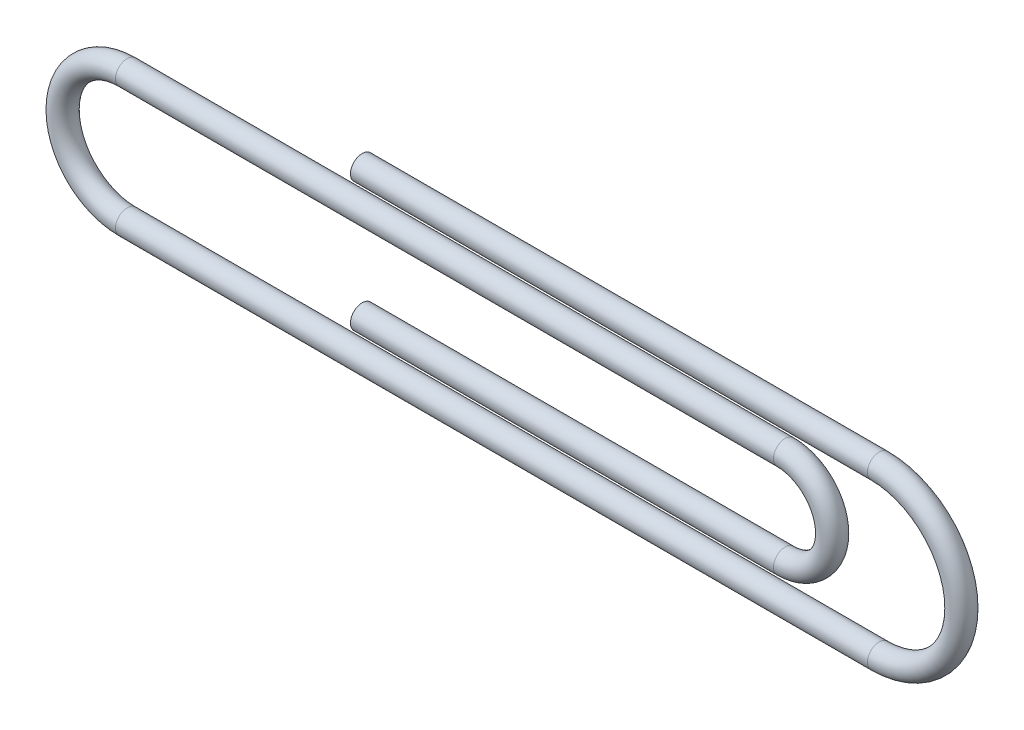
ISO-10303-21;
HEADER;
FILE_DESCRIPTION(('STEP AP214'),'2;1');
FILE_NAME('part.step','',(''),(''),'','','');
FILE_SCHEMA(('AUTOMOTIVE_DESIGN { 1 0 10303 214 1 1 1 1 }'));
ENDSEC;
DATA;
#1=APPLICATION_CONTEXT('core data for automotive mechanical design processes');
#2=APPLICATION_PROTOCOL_DEFINITION('international standard','automotive_design',2000,#1);
#3=PRODUCT_CONTEXT('',#1,'mechanical');
#4=PRODUCT('Part','Part','',(#3));
#5=PRODUCT_RELATED_PRODUCT_CATEGORY('part','',(#4));
#6=PRODUCT_DEFINITION_FORMATION('','',#4);
#7=PRODUCT_DEFINITION_CONTEXT('part definition',#1,'design');
#8=PRODUCT_DEFINITION('design','',#6,#7);
#9=PRODUCT_DEFINITION_SHAPE('','',#8);
#10=(LENGTH_UNIT() NAMED_UNIT(*) SI_UNIT(.MILLI.,.METRE.));
#11=(NAMED_UNIT(*) PLANE_ANGLE_UNIT() SI_UNIT($,.RADIAN.));
#12=(NAMED_UNIT(*) SI_UNIT($,.STERADIAN.) SOLID_ANGLE_UNIT());
#13=UNCERTAINTY_MEASURE_WITH_UNIT(LENGTH_MEASURE(1.E-05),#10,'distance_accuracy_value','');
#14=(GEOMETRIC_REPRESENTATION_CONTEXT(3) GLOBAL_UNCERTAINTY_ASSIGNED_CONTEXT((#13)) GLOBAL_UNIT_ASSIGNED_CONTEXT((#10,
#11,#12)) REPRESENTATION_CONTEXT('',''));
#15=CARTESIAN_POINT('',(0.,0.,0.));
#16=DIRECTION('',(0.,0.,1.));
#17=DIRECTION('',(1.,0.,0.));
#18=AXIS2_PLACEMENT_3D('',#15,#16,#17);
#19=CARTESIAN_POINT('',(-7.02459016393443,0.,0.));
#20=DIRECTION('',(-1.,0.,0.));
#21=DIRECTION('',(0.,-1.,0.));
#22=AXIS2_PLACEMENT_3D('',#19,#20,#21);
#23=PLANE('',#22);
#24=CARTESIAN_POINT('',(-7.02459016393443,0.,0.));
#25=DIRECTION('',(-1.,0.,0.));
#26=DIRECTION('',(0.,-1.,0.));
#27=AXIS2_PLACEMENT_3D('',#24,#25,#26);
#28=CIRCLE('',#27,0.5);
#29=CARTESIAN_POINT('',(-7.02459016393443,-0.5,0.));
#30=VERTEX_POINT('',#29);
#31=EDGE_CURVE('E88',#30,#30,#28,.T.);
#32=ORIENTED_EDGE('',*,*,#31,.T.);
#33=EDGE_LOOP('',(#32));
#34=FACE_BOUND('',#33,.T.);
#35=ADVANCED_FACE('F53',(#34),#23,.T.);
#36=CARTESIAN_POINT('',(-7.02459016393443,-5.5,0.));
#37=DIRECTION('',(1.,0.,0.));
#38=DIRECTION('',(0.,1.,0.));
#39=AXIS2_PLACEMENT_3D('',#36,#37,#38);
#40=PLANE('',#39);
#41=CARTESIAN_POINT('',(-7.02459016393443,-5.5,0.));
#42=DIRECTION('',(1.,0.,0.));
#43=DIRECTION('',(0.,1.,0.));
#44=AXIS2_PLACEMENT_3D('',#41,#42,#43);
#45=CIRCLE('',#44,0.5);
#46=CARTESIAN_POINT('',(-7.02459016393443,-5.,0.));
#47=VERTEX_POINT('',#46);
#48=EDGE_CURVE('E11',#47,#47,#45,.T.);
#49=ORIENTED_EDGE('',*,*,#48,.F.);
#50=EDGE_LOOP('',(#49));
#51=FACE_BOUND('',#50,.T.);
#52=ADVANCED_FACE('F97',(#51),#40,.F.);
#53=CARTESIAN_POINT('',(-7.02459016393443,0.,0.));
#54=DIRECTION('',(1.,0.,0.));
#55=DIRECTION('',(0.,1.,0.));
#56=AXIS2_PLACEMENT_3D('',#53,#54,#55);
#57=CYLINDRICAL_SURFACE('',#56,0.5);
#58=CARTESIAN_POINT('',(14.9754098360656,0.,0.));
#59=DIRECTION('',(-1.,0.,0.));
#60=DIRECTION('',(0.,-1.,0.));
#61=AXIS2_PLACEMENT_3D('',#58,#59,#60);
#62=CIRCLE('',#61,0.5);
#63=CARTESIAN_POINT('',(14.9754098360656,0.5,0.));
#64=VERTEX_POINT('',#63);
#65=EDGE_CURVE('E84',#64,#64,#62,.T.);
#66=ORIENTED_EDGE('',*,*,#65,.T.);
#67=EDGE_LOOP('',(#66));
#68=FACE_BOUND('',#67,.T.);
#69=ORIENTED_EDGE('',*,*,#31,.F.);
#70=EDGE_LOOP('',(#69));
#71=FACE_BOUND('',#70,.T.);
#72=ADVANCED_FACE('F94',(#68,#71),#57,.T.);
#73=CARTESIAN_POINT('',(14.9754098360656,-3.5,0.));
#74=DIRECTION('',(0.,0.,-1.));
#75=DIRECTION('',(-1.,0.,0.));
#76=AXIS2_PLACEMENT_3D('',#73,#74,#75);
#77=TOROIDAL_SURFACE('',#76,3.5,0.5);
#78=CARTESIAN_POINT('',(14.9754098360656,-7.,0.));
#79=DIRECTION('',(1.,0.,0.));
#80=DIRECTION('',(0.,1.,0.));
#81=AXIS2_PLACEMENT_3D('',#78,#79,#80);
#82=CIRCLE('',#81,0.5);
#83=CARTESIAN_POINT('',(14.9754098360656,-7.5,0.));
#84=VERTEX_POINT('',#83);
#85=EDGE_CURVE('E80',#84,#84,#82,.T.);
#86=CARTESIAN_POINT('',(14.9754098360656,-3.5,0.));
#87=DIRECTION('',(0.,0.,-1.));
#88=DIRECTION('',(-1.,0.,0.));
#89=AXIS2_PLACEMENT_3D('',#86,#87,#88);
#90=CIRCLE('',#89,4.);
#91=EDGE_CURVE('',#64,#84,#90,.T.);
#92=ORIENTED_EDGE('',*,*,#65,.F.);
#93=ORIENTED_EDGE('',*,*,#85,.T.);
#94=ORIENTED_EDGE('',*,*,#91,.T.);
#95=ORIENTED_EDGE('',*,*,#91,.F.);
#96=EDGE_LOOP('',(#92,#94,#93,#95));
#97=FACE_BOUND('',#96,.T.);
#98=ADVANCED_FACE('F96',(#97),#77,.T.);
#99=CARTESIAN_POINT('',(14.9754098360656,-7.,0.));
#100=DIRECTION('',(-1.,0.,0.));
#101=DIRECTION('',(0.,-1.,0.));
#102=AXIS2_PLACEMENT_3D('',#99,#100,#101);
#103=CYLINDRICAL_SURFACE('',#102,0.5);
#104=CARTESIAN_POINT('',(-17.0245901639344,-7.00000000000001,0.));
#105=DIRECTION('',(1.,0.,0.));
#106=DIRECTION('',(0.,1.,0.));
#107=AXIS2_PLACEMENT_3D('',#104,#105,#106);
#108=CIRCLE('',#107,0.5);
#109=CARTESIAN_POINT('',(-17.0245901639344,-7.50000000000001,0.));
#110=VERTEX_POINT('',#109);
#111=EDGE_CURVE('E76',#110,#110,#108,.T.);
#112=ORIENTED_EDGE('',*,*,#111,.T.);
#113=EDGE_LOOP('',(#112));
#114=FACE_BOUND('',#113,.T.);
#115=ORIENTED_EDGE('',*,*,#85,.F.);
#116=EDGE_LOOP('',(#115));
#117=FACE_BOUND('',#116,.T.);
#118=ADVANCED_FACE('F104',(#114,#117),#103,.T.);
#119=CARTESIAN_POINT('',(-17.0245901639344,-4.25,0.));
#120=DIRECTION('',(0.,0.,-1.));
#121=DIRECTION('',(-1.,0.,0.));
#122=AXIS2_PLACEMENT_3D('',#119,#120,#121);
#123=TOROIDAL_SURFACE('',#122,2.75,0.5);
#124=CARTESIAN_POINT('',(-17.0245901639344,-1.5,0.));
#125=DIRECTION('',(-1.,0.,0.));
#126=DIRECTION('',(0.,-1.,0.));
#127=AXIS2_PLACEMENT_3D('',#124,#125,#126);
#128=CIRCLE('',#127,0.5);
#129=CARTESIAN_POINT('',(-17.0245901639344,-0.999999999999998,0.));
#130=VERTEX_POINT('',#129);
#131=EDGE_CURVE('E70',#130,#130,#128,.T.);
#132=CARTESIAN_POINT('',(-17.0245901639344,-4.25,0.));
#133=DIRECTION('',(0.,0.,-1.));
#134=DIRECTION('',(-1.,0.,0.));
#135=AXIS2_PLACEMENT_3D('',#132,#133,#134);
#136=CIRCLE('',#135,3.25);
#137=EDGE_CURVE('',#110,#130,#136,.T.);
#138=ORIENTED_EDGE('',*,*,#111,.F.);
#139=ORIENTED_EDGE('',*,*,#131,.T.);
#140=ORIENTED_EDGE('',*,*,#137,.T.);
#141=ORIENTED_EDGE('',*,*,#137,.F.);
#142=EDGE_LOOP('',(#138,#140,#139,#141));
#143=FACE_BOUND('',#142,.T.);
#144=ADVANCED_FACE('F121',(#143),#123,.T.);
#145=CARTESIAN_POINT('',(-17.0245901639344,-1.5,0.));
#146=DIRECTION('',(1.,0.,0.));
#147=DIRECTION('',(0.,0.,-1.));
#148=AXIS2_PLACEMENT_3D('',#145,#146,#147);
#149=CYLINDRICAL_SURFACE('',#148,0.5);
#150=CARTESIAN_POINT('',(10.9754098360656,-1.5,0.));
#151=DIRECTION('',(-1.,0.,0.));
#152=DIRECTION('',(0.,-1.,0.));
#153=AXIS2_PLACEMENT_3D('',#150,#151,#152);
#154=CIRCLE('',#153,0.5);
#155=CARTESIAN_POINT('',(10.9754098360656,-1.,0.));
#156=VERTEX_POINT('',#155);
#157=EDGE_CURVE('E65',#156,#156,#154,.T.);
#158=ORIENTED_EDGE('',*,*,#157,.T.);
#159=EDGE_LOOP('',(#158));
#160=FACE_BOUND('',#159,.T.);
#161=ORIENTED_EDGE('',*,*,#131,.F.);
#162=EDGE_LOOP('',(#161));
#163=FACE_BOUND('',#162,.T.);
#164=ADVANCED_FACE('F115',(#160,#163),#149,.T.);
#165=CARTESIAN_POINT('',(10.9754098360656,-3.5,0.));
#166=DIRECTION('',(0.,0.,-1.));
#167=DIRECTION('',(-1.,0.,0.));
#168=AXIS2_PLACEMENT_3D('',#165,#166,#167);
#169=TOROIDAL_SURFACE('',#168,2.,0.5);
#170=CARTESIAN_POINT('',(10.9754098360656,-5.5,0.));
#171=DIRECTION('',(1.,0.,0.));
#172=DIRECTION('',(0.,1.,0.));
#173=AXIS2_PLACEMENT_3D('',#170,#171,#172);
#174=CIRCLE('',#173,0.5);
#175=CARTESIAN_POINT('',(10.9754098360656,-6.,0.));
#176=VERTEX_POINT('',#175);
#177=EDGE_CURVE('E60',#176,#176,#174,.T.);
#178=CARTESIAN_POINT('',(10.9754098360656,-3.5,0.));
#179=DIRECTION('',(0.,0.,-1.));
#180=DIRECTION('',(-1.,0.,0.));
#181=AXIS2_PLACEMENT_3D('',#178,#179,#180);
#182=CIRCLE('',#181,2.5);
#183=EDGE_CURVE('',#156,#176,#182,.T.);
#184=ORIENTED_EDGE('',*,*,#157,.F.);
#185=ORIENTED_EDGE('',*,*,#177,.T.);
#186=ORIENTED_EDGE('',*,*,#183,.T.);
#187=ORIENTED_EDGE('',*,*,#183,.F.);
#188=EDGE_LOOP('',(#184,#186,#185,#187));
#189=FACE_BOUND('',#188,.T.);
#190=ADVANCED_FACE('F110',(#189),#169,.T.);
#191=CARTESIAN_POINT('',(10.9754098360656,-5.5,0.));
#192=DIRECTION('',(-1.,0.,0.));
#193=DIRECTION('',(0.,-1.,0.));
#194=AXIS2_PLACEMENT_3D('',#191,#192,#193);
#195=CYLINDRICAL_SURFACE('',#194,0.5);
#196=ORIENTED_EDGE('',*,*,#48,.T.);
#197=EDGE_LOOP('',(#196));
#198=FACE_BOUND('',#197,.T.);
#199=ORIENTED_EDGE('',*,*,#177,.F.);
#200=EDGE_LOOP('',(#199));
#201=FACE_BOUND('',#200,.T.);
#202=ADVANCED_FACE('F108',(#198,#201),#195,.T.);
#203=CLOSED_SHELL('',(#35,#52,#72,#98,#118,#144,#164,#190,#202));
#204=MANIFOLD_SOLID_BREP('B2',#203);
#205=ADVANCED_BREP_SHAPE_REPRESENTATION('',(#18,#204),#14);
#206=SHAPE_DEFINITION_REPRESENTATION(#9,#205);
ENDSEC;
END-ISO-10303-21;
